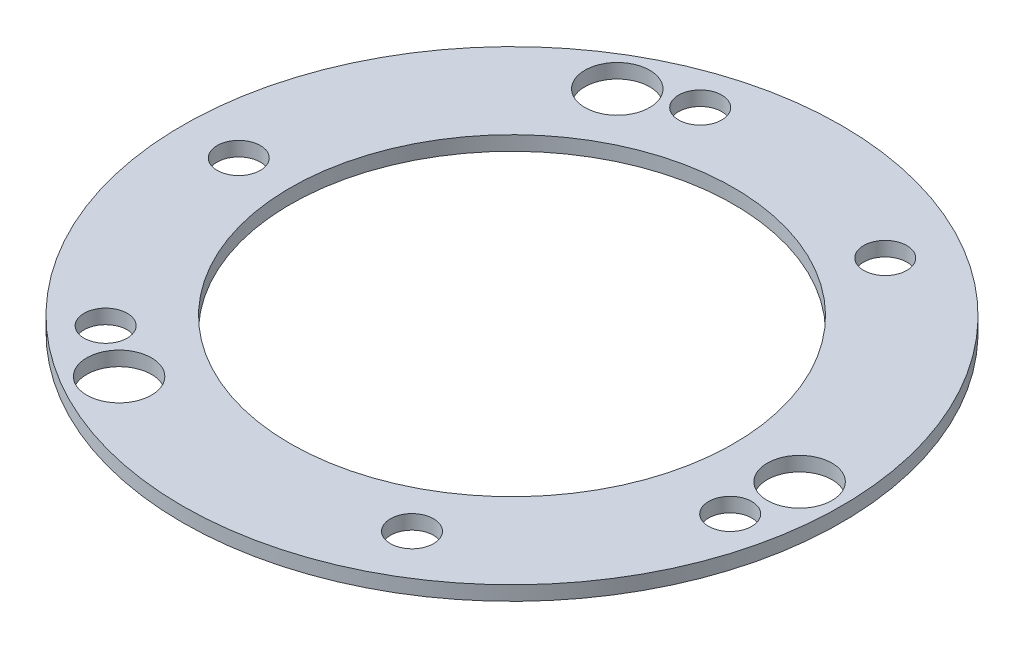
ISO-10303-21;
HEADER;
FILE_DESCRIPTION(('STEP AP214'),'2;1');
FILE_NAME('part.step','',(''),(''),'','','');
FILE_SCHEMA(('AUTOMOTIVE_DESIGN { 1 0 10303 214 1 1 1 1 }'));
ENDSEC;
DATA;
#1=APPLICATION_CONTEXT('core data for automotive mechanical design processes');
#2=APPLICATION_PROTOCOL_DEFINITION('international standard','automotive_design',2000,#1);
#3=PRODUCT_CONTEXT('',#1,'mechanical');
#4=PRODUCT('Part','Part','',(#3));
#5=PRODUCT_RELATED_PRODUCT_CATEGORY('part','',(#4));
#6=PRODUCT_DEFINITION_FORMATION('','',#4);
#7=PRODUCT_DEFINITION_CONTEXT('part definition',#1,'design');
#8=PRODUCT_DEFINITION('design','',#6,#7);
#9=PRODUCT_DEFINITION_SHAPE('','',#8);
#10=(LENGTH_UNIT() NAMED_UNIT(*) SI_UNIT(.MILLI.,.METRE.));
#11=(NAMED_UNIT(*) PLANE_ANGLE_UNIT() SI_UNIT($,.RADIAN.));
#12=(NAMED_UNIT(*) SI_UNIT($,.STERADIAN.) SOLID_ANGLE_UNIT());
#13=UNCERTAINTY_MEASURE_WITH_UNIT(LENGTH_MEASURE(1.E-05),#10,'distance_accuracy_value','');
#14=(GEOMETRIC_REPRESENTATION_CONTEXT(3) GLOBAL_UNCERTAINTY_ASSIGNED_CONTEXT((#13)) GLOBAL_UNIT_ASSIGNED_CONTEXT((#10,
#11,#12)) REPRESENTATION_CONTEXT('',''));
#15=CARTESIAN_POINT('',(0.,0.,0.));
#16=DIRECTION('',(0.,0.,1.));
#17=DIRECTION('',(1.,0.,0.));
#18=AXIS2_PLACEMENT_3D('',#15,#16,#17);
#19=CARTESIAN_POINT('',(0.,12.,0.));
#20=DIRECTION('',(0.,1.,0.));
#21=DIRECTION('',(0.,0.,1.));
#22=AXIS2_PLACEMENT_3D('',#19,#20,#21);
#23=PLANE('',#22);
#24=CARTESIAN_POINT('',(-228.,12.,0.));
#25=DIRECTION('',(0.,1.,0.));
#26=DIRECTION('',(0.,0.,1.));
#27=AXIS2_PLACEMENT_3D('',#24,#25,#26);
#28=CIRCLE('',#27,18.);
#29=CARTESIAN_POINT('',(-228.,12.,18.));
#30=VERTEX_POINT('',#29);
#31=EDGE_CURVE('E57',#30,#30,#28,.T.);
#32=ORIENTED_EDGE('',*,*,#31,.F.);
#33=EDGE_LOOP('',(#32));
#34=FACE_BOUND('',#33,.T.);
#35=CARTESIAN_POINT('',(114.,12.,-197.453792062852));
#36=DIRECTION('',(0.,1.,0.));
#37=DIRECTION('',(0.,0.,1.));
#38=AXIS2_PLACEMENT_3D('',#35,#36,#37);
#39=CIRCLE('',#38,18.);
#40=CARTESIAN_POINT('',(114.,12.,-179.453792062852));
#41=VERTEX_POINT('',#40);
#42=EDGE_CURVE('E136',#41,#41,#39,.T.);
#43=ORIENTED_EDGE('',*,*,#42,.F.);
#44=EDGE_LOOP('',(#43));
#45=FACE_BOUND('',#44,.T.);
#46=CARTESIAN_POINT('',(114.000000000001,12.,197.453792062852));
#47=DIRECTION('',(0.,1.,0.));
#48=DIRECTION('',(0.,0.,1.));
#49=AXIS2_PLACEMENT_3D('',#46,#47,#48);
#50=CIRCLE('',#49,18.);
#51=CARTESIAN_POINT('',(114.000000000001,12.,215.453792062852));
#52=VERTEX_POINT('',#51);
#53=EDGE_CURVE('E140',#52,#52,#50,.T.);
#54=ORIENTED_EDGE('',*,*,#53,.F.);
#55=EDGE_LOOP('',(#54));
#56=FACE_BOUND('',#55,.T.);
#57=CARTESIAN_POINT('',(-71.9353451816777,12.,-228.965731308405));
#58=DIRECTION('',(0.,1.,0.));
#59=DIRECTION('',(0.,0.,1.));
#60=AXIS2_PLACEMENT_3D('',#57,#58,#59);
#61=CIRCLE('',#60,18.);
#62=CARTESIAN_POINT('',(-71.9353451816777,12.,-210.965731308405));
#63=VERTEX_POINT('',#62);
#64=EDGE_CURVE('E75',#63,#63,#61,.T.);
#65=ORIENTED_EDGE('',*,*,#64,.F.);
#66=EDGE_LOOP('',(#65));
#67=FACE_BOUND('',#66,.T.);
#68=CARTESIAN_POINT('',(-120.,12.,207.846096908265));
#69=DIRECTION('',(0.,1.,0.));
#70=DIRECTION('',(0.,0.,1.));
#71=AXIS2_PLACEMENT_3D('',#68,#69,#70);
#72=CIRCLE('',#71,27.);
#73=CARTESIAN_POINT('',(-120.,12.,234.846096908265));
#74=VERTEX_POINT('',#73);
#75=EDGE_CURVE('E87',#74,#74,#72,.T.);
#76=ORIENTED_EDGE('',*,*,#75,.F.);
#77=EDGE_LOOP('',(#76));
#78=FACE_BOUND('',#77,.T.);
#79=CARTESIAN_POINT('',(240.,12.,0.));
#80=DIRECTION('',(0.,1.,0.));
#81=DIRECTION('',(0.,0.,1.));
#82=AXIS2_PLACEMENT_3D('',#79,#80,#81);
#83=CIRCLE('',#82,27.);
#84=CARTESIAN_POINT('',(240.,12.,27.));
#85=VERTEX_POINT('',#84);
#86=EDGE_CURVE('E99',#85,#85,#83,.T.);
#87=ORIENTED_EDGE('',*,*,#86,.F.);
#88=EDGE_LOOP('',(#87));
#89=FACE_BOUND('',#88,.T.);
#90=CARTESIAN_POINT('',(0.,12.,0.));
#91=DIRECTION('',(0.,1.,0.));
#92=DIRECTION('',(0.,0.,1.));
#93=AXIS2_PLACEMENT_3D('',#90,#91,#92);
#94=CIRCLE('',#93,275.);
#95=CARTESIAN_POINT('',(0.,12.,275.));
#96=VERTEX_POINT('',#95);
#97=EDGE_CURVE('E10',#96,#96,#94,.T.);
#98=ORIENTED_EDGE('',*,*,#97,.T.);
#99=EDGE_LOOP('',(#98));
#100=FACE_BOUND('',#99,.T.);
#101=CARTESIAN_POINT('',(0.,12.,0.));
#102=DIRECTION('',(0.,1.,0.));
#103=DIRECTION('',(0.,0.,1.));
#104=AXIS2_PLACEMENT_3D('',#101,#102,#103);
#105=CIRCLE('',#104,185.);
#106=CARTESIAN_POINT('',(0.,12.,185.));
#107=VERTEX_POINT('',#106);
#108=EDGE_CURVE('E48',#107,#107,#105,.T.);
#109=ORIENTED_EDGE('',*,*,#108,.F.);
#110=EDGE_LOOP('',(#109));
#111=FACE_BOUND('',#110,.T.);
#112=CARTESIAN_POINT('',(234.2578125,12.,52.1850292968668));
#113=DIRECTION('',(0.,1.,0.));
#114=DIRECTION('',(0.,0.,1.));
#115=AXIS2_PLACEMENT_3D('',#112,#113,#114);
#116=CIRCLE('',#115,18.);
#117=CARTESIAN_POINT('',(234.2578125,12.,70.1850292968668));
#118=VERTEX_POINT('',#117);
#119=EDGE_CURVE('E93',#118,#118,#116,.T.);
#120=ORIENTED_EDGE('',*,*,#119,.F.);
#121=EDGE_LOOP('',(#120));
#122=FACE_BOUND('',#121,.T.);
#123=CARTESIAN_POINT('',(-120.,12.,-207.846096908266));
#124=DIRECTION('',(0.,1.,0.));
#125=DIRECTION('',(0.,0.,1.));
#126=AXIS2_PLACEMENT_3D('',#123,#124,#125);
#127=CIRCLE('',#126,27.);
#128=CARTESIAN_POINT('',(-120.,12.,-180.846096908265));
#129=VERTEX_POINT('',#128);
#130=EDGE_CURVE('E81',#129,#129,#127,.T.);
#131=ORIENTED_EDGE('',*,*,#130,.F.);
#132=EDGE_LOOP('',(#131));
#133=FACE_BOUND('',#132,.T.);
#134=CARTESIAN_POINT('',(-162.322467318322,12.,176.780702011538));
#135=DIRECTION('',(0.,1.,0.));
#136=DIRECTION('',(0.,0.,1.));
#137=AXIS2_PLACEMENT_3D('',#134,#135,#136);
#138=CIRCLE('',#137,18.);
#139=CARTESIAN_POINT('',(-162.322467318322,12.,194.780702011538));
#140=VERTEX_POINT('',#139);
#141=EDGE_CURVE('E66',#140,#140,#138,.T.);
#142=ORIENTED_EDGE('',*,*,#141,.F.);
#143=EDGE_LOOP('',(#142));
#144=FACE_BOUND('',#143,.T.);
#145=ADVANCED_FACE('F35',(#34,#45,#56,#67,#78,#89,#100,#111,#122,#133,#144),#23,.T.);
#146=CARTESIAN_POINT('',(0.,0.,0.));
#147=DIRECTION('',(0.,1.,0.));
#148=DIRECTION('',(0.,0.,1.));
#149=AXIS2_PLACEMENT_3D('',#146,#147,#148);
#150=PLANE('',#149);
#151=CARTESIAN_POINT('',(-228.,0.,0.));
#152=DIRECTION('',(0.,1.,0.));
#153=DIRECTION('',(0.,0.,1.));
#154=AXIS2_PLACEMENT_3D('',#151,#152,#153);
#155=CIRCLE('',#154,18.);
#156=CARTESIAN_POINT('',(-228.,0.,18.));
#157=VERTEX_POINT('',#156);
#158=EDGE_CURVE('E39',#157,#157,#155,.T.);
#159=ORIENTED_EDGE('',*,*,#158,.T.);
#160=EDGE_LOOP('',(#159));
#161=FACE_BOUND('',#160,.T.);
#162=CARTESIAN_POINT('',(114.,0.,-197.453792062852));
#163=DIRECTION('',(0.,1.,0.));
#164=DIRECTION('',(0.,0.,1.));
#165=AXIS2_PLACEMENT_3D('',#162,#163,#164);
#166=CIRCLE('',#165,18.);
#167=CARTESIAN_POINT('',(114.,0.,-179.453792062852));
#168=VERTEX_POINT('',#167);
#169=EDGE_CURVE('E56',#168,#168,#166,.T.);
#170=ORIENTED_EDGE('',*,*,#169,.T.);
#171=EDGE_LOOP('',(#170));
#172=FACE_BOUND('',#171,.T.);
#173=CARTESIAN_POINT('',(114.000000000001,0.,197.453792062852));
#174=DIRECTION('',(0.,1.,0.));
#175=DIRECTION('',(0.,0.,1.));
#176=AXIS2_PLACEMENT_3D('',#173,#174,#175);
#177=CIRCLE('',#176,18.);
#178=CARTESIAN_POINT('',(114.000000000001,0.,215.453792062852));
#179=VERTEX_POINT('',#178);
#180=EDGE_CURVE('E54',#179,#179,#177,.T.);
#181=ORIENTED_EDGE('',*,*,#180,.T.);
#182=EDGE_LOOP('',(#181));
#183=FACE_BOUND('',#182,.T.);
#184=CARTESIAN_POINT('',(0.,0.,0.));
#185=DIRECTION('',(0.,1.,0.));
#186=DIRECTION('',(0.,0.,1.));
#187=AXIS2_PLACEMENT_3D('',#184,#185,#186);
#188=CIRCLE('',#187,275.);
#189=CARTESIAN_POINT('',(0.,0.,275.));
#190=VERTEX_POINT('',#189);
#191=EDGE_CURVE('E43',#190,#190,#188,.T.);
#192=ORIENTED_EDGE('',*,*,#191,.F.);
#193=EDGE_LOOP('',(#192));
#194=FACE_BOUND('',#193,.T.);
#195=CARTESIAN_POINT('',(0.,0.,0.));
#196=DIRECTION('',(0.,1.,0.));
#197=DIRECTION('',(0.,0.,1.));
#198=AXIS2_PLACEMENT_3D('',#195,#196,#197);
#199=CIRCLE('',#198,185.);
#200=CARTESIAN_POINT('',(0.,0.,185.));
#201=VERTEX_POINT('',#200);
#202=EDGE_CURVE('E51',#201,#201,#199,.T.);
#203=ORIENTED_EDGE('',*,*,#202,.T.);
#204=EDGE_LOOP('',(#203));
#205=FACE_BOUND('',#204,.T.);
#206=CARTESIAN_POINT('',(240.,0.,0.));
#207=DIRECTION('',(0.,1.,0.));
#208=DIRECTION('',(0.,0.,1.));
#209=AXIS2_PLACEMENT_3D('',#206,#207,#208);
#210=CIRCLE('',#209,27.);
#211=CARTESIAN_POINT('',(240.,0.,27.));
#212=VERTEX_POINT('',#211);
#213=EDGE_CURVE('E96',#212,#212,#210,.T.);
#214=ORIENTED_EDGE('',*,*,#213,.T.);
#215=EDGE_LOOP('',(#214));
#216=FACE_BOUND('',#215,.T.);
#217=CARTESIAN_POINT('',(234.2578125,0.,52.1850292968668));
#218=DIRECTION('',(0.,1.,0.));
#219=DIRECTION('',(0.,0.,1.));
#220=AXIS2_PLACEMENT_3D('',#217,#218,#219);
#221=CIRCLE('',#220,18.);
#222=CARTESIAN_POINT('',(234.2578125,0.,70.1850292968668));
#223=VERTEX_POINT('',#222);
#224=EDGE_CURVE('E90',#223,#223,#221,.T.);
#225=ORIENTED_EDGE('',*,*,#224,.T.);
#226=EDGE_LOOP('',(#225));
#227=FACE_BOUND('',#226,.T.);
#228=CARTESIAN_POINT('',(-120.,0.,207.846096908265));
#229=DIRECTION('',(0.,1.,0.));
#230=DIRECTION('',(0.,0.,1.));
#231=AXIS2_PLACEMENT_3D('',#228,#229,#230);
#232=CIRCLE('',#231,27.);
#233=CARTESIAN_POINT('',(-120.,0.,234.846096908265));
#234=VERTEX_POINT('',#233);
#235=EDGE_CURVE('E84',#234,#234,#232,.T.);
#236=ORIENTED_EDGE('',*,*,#235,.T.);
#237=EDGE_LOOP('',(#236));
#238=FACE_BOUND('',#237,.T.);
#239=CARTESIAN_POINT('',(-120.,0.,-207.846096908266));
#240=DIRECTION('',(0.,1.,0.));
#241=DIRECTION('',(0.,0.,1.));
#242=AXIS2_PLACEMENT_3D('',#239,#240,#241);
#243=CIRCLE('',#242,27.);
#244=CARTESIAN_POINT('',(-120.,0.,-180.846096908265));
#245=VERTEX_POINT('',#244);
#246=EDGE_CURVE('E78',#245,#245,#243,.T.);
#247=ORIENTED_EDGE('',*,*,#246,.T.);
#248=EDGE_LOOP('',(#247));
#249=FACE_BOUND('',#248,.T.);
#250=CARTESIAN_POINT('',(-71.9353451816777,0.,-228.965731308405));
#251=DIRECTION('',(0.,1.,0.));
#252=DIRECTION('',(0.,0.,1.));
#253=AXIS2_PLACEMENT_3D('',#250,#251,#252);
#254=CIRCLE('',#253,18.);
#255=CARTESIAN_POINT('',(-71.9353451816777,0.,-210.965731308405));
#256=VERTEX_POINT('',#255);
#257=EDGE_CURVE('E71',#256,#256,#254,.T.);
#258=ORIENTED_EDGE('',*,*,#257,.T.);
#259=EDGE_LOOP('',(#258));
#260=FACE_BOUND('',#259,.T.);
#261=CARTESIAN_POINT('',(-162.322467318322,0.,176.780702011538));
#262=DIRECTION('',(0.,1.,0.));
#263=DIRECTION('',(0.,0.,1.));
#264=AXIS2_PLACEMENT_3D('',#261,#262,#263);
#265=CIRCLE('',#264,18.);
#266=CARTESIAN_POINT('',(-162.322467318322,0.,194.780702011538));
#267=VERTEX_POINT('',#266);
#268=EDGE_CURVE('E62',#267,#267,#265,.T.);
#269=ORIENTED_EDGE('',*,*,#268,.T.);
#270=EDGE_LOOP('',(#269));
#271=FACE_BOUND('',#270,.T.);
#272=ADVANCED_FACE('F109',(#161,#172,#183,#194,#205,#216,#227,#238,#249,#260,#271),#150,.F.);
#273=CARTESIAN_POINT('',(0.,12.,0.));
#274=DIRECTION('',(0.,-1.,0.));
#275=DIRECTION('',(0.,0.,-1.));
#276=AXIS2_PLACEMENT_3D('',#273,#274,#275);
#277=CYLINDRICAL_SURFACE('',#276,275.);
#278=ORIENTED_EDGE('',*,*,#97,.F.);
#279=EDGE_LOOP('',(#278));
#280=FACE_BOUND('',#279,.T.);
#281=ORIENTED_EDGE('',*,*,#191,.T.);
#282=EDGE_LOOP('',(#281));
#283=FACE_BOUND('',#282,.T.);
#284=ADVANCED_FACE('F37',(#280,#283),#277,.T.);
#285=CARTESIAN_POINT('',(0.,12.,0.));
#286=DIRECTION('',(0.,-1.,0.));
#287=DIRECTION('',(0.,0.,-1.));
#288=AXIS2_PLACEMENT_3D('',#285,#286,#287);
#289=CYLINDRICAL_SURFACE('',#288,185.);
#290=ORIENTED_EDGE('',*,*,#108,.T.);
#291=EDGE_LOOP('',(#290));
#292=FACE_BOUND('',#291,.T.);
#293=ORIENTED_EDGE('',*,*,#202,.F.);
#294=EDGE_LOOP('',(#293));
#295=FACE_BOUND('',#294,.T.);
#296=ADVANCED_FACE('F112',(#292,#295),#289,.F.);
#297=CARTESIAN_POINT('',(240.,12.,0.));
#298=DIRECTION('',(0.,-1.,0.));
#299=DIRECTION('',(0.,0.,-1.));
#300=AXIS2_PLACEMENT_3D('',#297,#298,#299);
#301=CYLINDRICAL_SURFACE('',#300,27.);
#302=ORIENTED_EDGE('',*,*,#86,.T.);
#303=EDGE_LOOP('',(#302));
#304=FACE_BOUND('',#303,.T.);
#305=ORIENTED_EDGE('',*,*,#213,.F.);
#306=EDGE_LOOP('',(#305));
#307=FACE_BOUND('',#306,.T.);
#308=ADVANCED_FACE('F114',(#304,#307),#301,.F.);
#309=CARTESIAN_POINT('',(234.2578125,12.,52.1850292968668));
#310=DIRECTION('',(0.,-1.,0.));
#311=DIRECTION('',(0.,0.,-1.));
#312=AXIS2_PLACEMENT_3D('',#309,#310,#311);
#313=CYLINDRICAL_SURFACE('',#312,18.);
#314=ORIENTED_EDGE('',*,*,#119,.T.);
#315=EDGE_LOOP('',(#314));
#316=FACE_BOUND('',#315,.T.);
#317=ORIENTED_EDGE('',*,*,#224,.F.);
#318=EDGE_LOOP('',(#317));
#319=FACE_BOUND('',#318,.T.);
#320=ADVANCED_FACE('F120',(#316,#319),#313,.F.);
#321=CARTESIAN_POINT('',(-120.,12.,207.846096908265));
#322=DIRECTION('',(0.,-1.,0.));
#323=DIRECTION('',(0.,0.,-1.));
#324=AXIS2_PLACEMENT_3D('',#321,#322,#323);
#325=CYLINDRICAL_SURFACE('',#324,27.);
#326=ORIENTED_EDGE('',*,*,#75,.T.);
#327=EDGE_LOOP('',(#326));
#328=FACE_BOUND('',#327,.T.);
#329=ORIENTED_EDGE('',*,*,#235,.F.);
#330=EDGE_LOOP('',(#329));
#331=FACE_BOUND('',#330,.T.);
#332=ADVANCED_FACE('F174',(#328,#331),#325,.F.);
#333=CARTESIAN_POINT('',(-120.,12.,-207.846096908266));
#334=DIRECTION('',(0.,-1.,0.));
#335=DIRECTION('',(0.,0.,-1.));
#336=AXIS2_PLACEMENT_3D('',#333,#334,#335);
#337=CYLINDRICAL_SURFACE('',#336,27.);
#338=ORIENTED_EDGE('',*,*,#130,.T.);
#339=EDGE_LOOP('',(#338));
#340=FACE_BOUND('',#339,.T.);
#341=ORIENTED_EDGE('',*,*,#246,.F.);
#342=EDGE_LOOP('',(#341));
#343=FACE_BOUND('',#342,.T.);
#344=ADVANCED_FACE('F167',(#340,#343),#337,.F.);
#345=CARTESIAN_POINT('',(-71.9353451816777,12.,-228.965731308405));
#346=DIRECTION('',(0.,-1.,0.));
#347=DIRECTION('',(0.,0.,-1.));
#348=AXIS2_PLACEMENT_3D('',#345,#346,#347);
#349=CYLINDRICAL_SURFACE('',#348,18.);
#350=ORIENTED_EDGE('',*,*,#64,.T.);
#351=EDGE_LOOP('',(#350));
#352=FACE_BOUND('',#351,.T.);
#353=ORIENTED_EDGE('',*,*,#257,.F.);
#354=EDGE_LOOP('',(#353));
#355=FACE_BOUND('',#354,.T.);
#356=ADVANCED_FACE('F158',(#352,#355),#349,.F.);
#357=CARTESIAN_POINT('',(-162.322467318322,12.,176.780702011538));
#358=DIRECTION('',(0.,-1.,0.));
#359=DIRECTION('',(0.,0.,-1.));
#360=AXIS2_PLACEMENT_3D('',#357,#358,#359);
#361=CYLINDRICAL_SURFACE('',#360,18.);
#362=ORIENTED_EDGE('',*,*,#141,.T.);
#363=EDGE_LOOP('',(#362));
#364=FACE_BOUND('',#363,.T.);
#365=ORIENTED_EDGE('',*,*,#268,.F.);
#366=EDGE_LOOP('',(#365));
#367=FACE_BOUND('',#366,.T.);
#368=ADVANCED_FACE('F154',(#364,#367),#361,.F.);
#369=CARTESIAN_POINT('',(114.000000000001,-1.2E-05,197.453792062852));
#370=DIRECTION('',(0.,1.,0.));
#371=DIRECTION('',(0.,0.,1.));
#372=AXIS2_PLACEMENT_3D('',#369,#370,#371);
#373=CYLINDRICAL_SURFACE('',#372,18.);
#374=CARTESIAN_POINT('',(114.000000000001,12.,215.453792062852));
#375=CARTESIAN_POINT('',(114.000000000001,11.875,215.453792062852));
#376=CARTESIAN_POINT('',(114.000000000001,11.75,215.453792062852));
#377=CARTESIAN_POINT('',(114.000000000001,11.5,215.453792062852));
#378=CARTESIAN_POINT('',(114.000000000001,11.375,215.453792062852));
#379=CARTESIAN_POINT('',(114.000000000001,11.125,215.453792062852));
#380=CARTESIAN_POINT('',(114.000000000001,11.,215.453792062852));
#381=CARTESIAN_POINT('',(114.000000000001,10.75,215.453792062852));
#382=CARTESIAN_POINT('',(114.000000000001,10.625,215.453792062852));
#383=CARTESIAN_POINT('',(114.000000000001,10.375,215.453792062852));
#384=CARTESIAN_POINT('',(114.000000000001,10.25,215.453792062852));
#385=CARTESIAN_POINT('',(114.000000000001,10.,215.453792062852));
#386=CARTESIAN_POINT('',(114.000000000001,9.875,215.453792062852));
#387=CARTESIAN_POINT('',(114.000000000001,9.625,215.453792062852));
#388=CARTESIAN_POINT('',(114.000000000001,9.5,215.453792062852));
#389=CARTESIAN_POINT('',(114.000000000001,9.25,215.453792062852));
#390=CARTESIAN_POINT('',(114.000000000001,9.125,215.453792062852));
#391=CARTESIAN_POINT('',(114.000000000001,8.875,215.453792062852));
#392=CARTESIAN_POINT('',(114.000000000001,8.75,215.453792062852));
#393=CARTESIAN_POINT('',(114.000000000001,8.5,215.453792062852));
#394=CARTESIAN_POINT('',(114.000000000001,8.375,215.453792062852));
#395=CARTESIAN_POINT('',(114.000000000001,8.125,215.453792062852));
#396=CARTESIAN_POINT('',(114.000000000001,8.,215.453792062852));
#397=CARTESIAN_POINT('',(114.000000000001,7.75,215.453792062852));
#398=CARTESIAN_POINT('',(114.000000000001,7.625,215.453792062852));
#399=CARTESIAN_POINT('',(114.000000000001,7.375,215.453792062852));
#400=CARTESIAN_POINT('',(114.000000000001,7.25,215.453792062852));
#401=CARTESIAN_POINT('',(114.000000000001,7.,215.453792062852));
#402=CARTESIAN_POINT('',(114.000000000001,6.875,215.453792062852));
#403=CARTESIAN_POINT('',(114.000000000001,6.625,215.453792062852));
#404=CARTESIAN_POINT('',(114.000000000001,6.5,215.453792062852));
#405=CARTESIAN_POINT('',(114.000000000001,6.25,215.453792062852));
#406=CARTESIAN_POINT('',(114.000000000001,6.125,215.453792062852));
#407=CARTESIAN_POINT('',(114.000000000001,5.875,215.453792062852));
#408=CARTESIAN_POINT('',(114.000000000001,5.75,215.453792062852));
#409=CARTESIAN_POINT('',(114.000000000001,5.5,215.453792062852));
#410=CARTESIAN_POINT('',(114.000000000001,5.375,215.453792062852));
#411=CARTESIAN_POINT('',(114.000000000001,5.125,215.453792062852));
#412=CARTESIAN_POINT('',(114.000000000001,5.,215.453792062852));
#413=CARTESIAN_POINT('',(114.000000000001,4.75,215.453792062852));
#414=CARTESIAN_POINT('',(114.000000000001,4.625,215.453792062852));
#415=CARTESIAN_POINT('',(114.000000000001,4.375,215.453792062852));
#416=CARTESIAN_POINT('',(114.000000000001,4.25,215.453792062852));
#417=CARTESIAN_POINT('',(114.000000000001,4.,215.453792062852));
#418=CARTESIAN_POINT('',(114.000000000001,3.875,215.453792062852));
#419=CARTESIAN_POINT('',(114.000000000001,3.625,215.453792062852));
#420=CARTESIAN_POINT('',(114.000000000001,3.5,215.453792062852));
#421=CARTESIAN_POINT('',(114.000000000001,3.25,215.453792062852));
#422=CARTESIAN_POINT('',(114.000000000001,3.125,215.453792062852));
#423=CARTESIAN_POINT('',(114.000000000001,2.875,215.453792062852));
#424=CARTESIAN_POINT('',(114.000000000001,2.75,215.453792062852));
#425=CARTESIAN_POINT('',(114.000000000001,2.5,215.453792062852));
#426=CARTESIAN_POINT('',(114.000000000001,2.375,215.453792062852));
#427=CARTESIAN_POINT('',(114.000000000001,2.125,215.453792062852));
#428=CARTESIAN_POINT('',(114.000000000001,2.,215.453792062852));
#429=CARTESIAN_POINT('',(114.000000000001,1.75,215.453792062852));
#430=CARTESIAN_POINT('',(114.000000000001,1.625,215.453792062852));
#431=CARTESIAN_POINT('',(114.000000000001,1.375,215.453792062852));
#432=CARTESIAN_POINT('',(114.000000000001,1.25,215.453792062852));
#433=CARTESIAN_POINT('',(114.000000000001,1.,215.453792062852));
#434=CARTESIAN_POINT('',(114.000000000001,0.875000000000001,215.453792062852));
#435=CARTESIAN_POINT('',(114.000000000001,0.625000000000001,215.453792062852));
#436=CARTESIAN_POINT('',(114.000000000001,0.500000000000001,215.453792062852));
#437=CARTESIAN_POINT('',(114.000000000001,0.250000000000001,215.453792062852));
#438=CARTESIAN_POINT('',(114.000000000001,0.125000000000001,215.453792062852));
#439=CARTESIAN_POINT('',(114.000000000001,0.,215.453792062852));
#440=B_SPLINE_CURVE_WITH_KNOTS('',3,(#374,#375,#376,#377,#378,#379,#380,#381,#382,#383,#384,
#385,#386,#387,#388,#389,#390,#391,#392,#393,#394,#395,#396,#397,#398,#399,#400,#401,#402,#403,
#404,#405,#406,#407,#408,#409,#410,#411,#412,#413,#414,#415,#416,#417,#418,#419,#420,#421,#422,
#423,#424,#425,#426,#427,#428,#429,#430,#431,#432,#433,#434,#435,#436,#437,#438,#439),
.UNSPECIFIED.,.F.,.F.,(4,2,2,2,2,2,2,2,2,2,2,2,2,2,2,2,2,2,2,2,2,2,2,2,2,2,2,2,2,2,2,2,4),(0.,
0.375,0.750000000000001,1.125,1.5,1.875,2.25,2.625,3.,3.375,3.75,4.125,4.5,4.875,5.25,5.625,6.,
6.375,6.75,7.125,7.5,7.875,8.25,8.625,9.,9.375,9.75,10.125,10.5,10.875,11.25,11.625,12.),.UNSPECIFIED.);
#441=EDGE_CURVE('BSEAM157',#52,#179,#440,.T.);
#442=ORIENTED_EDGE('',*,*,#53,.T.);
#443=ORIENTED_EDGE('',*,*,#180,.F.);
#444=ORIENTED_EDGE('',*,*,#441,.T.);
#445=ORIENTED_EDGE('',*,*,#441,.F.);
#446=EDGE_LOOP('',(#442,#444,#443,#445));
#447=FACE_BOUND('',#446,.T.);
#448=ADVANCED_FACE('F157',(#447),#373,.F.);
#449=CARTESIAN_POINT('',(114.,-1.2E-05,-197.453792062852));
#450=DIRECTION('',(0.,1.,0.));
#451=DIRECTION('',(0.,0.,1.));
#452=AXIS2_PLACEMENT_3D('',#449,#450,#451);
#453=CYLINDRICAL_SURFACE('',#452,18.);
#454=CARTESIAN_POINT('',(114.,12.,-179.453792062852));
#455=CARTESIAN_POINT('',(114.,11.875,-179.453792062852));
#456=CARTESIAN_POINT('',(114.,11.75,-179.453792062852));
#457=CARTESIAN_POINT('',(114.,11.5,-179.453792062852));
#458=CARTESIAN_POINT('',(114.,11.375,-179.453792062852));
#459=CARTESIAN_POINT('',(114.,11.125,-179.453792062852));
#460=CARTESIAN_POINT('',(114.,11.,-179.453792062852));
#461=CARTESIAN_POINT('',(114.,10.75,-179.453792062852));
#462=CARTESIAN_POINT('',(114.,10.625,-179.453792062852));
#463=CARTESIAN_POINT('',(114.,10.375,-179.453792062852));
#464=CARTESIAN_POINT('',(114.,10.25,-179.453792062852));
#465=CARTESIAN_POINT('',(114.,10.,-179.453792062852));
#466=CARTESIAN_POINT('',(114.,9.875,-179.453792062852));
#467=CARTESIAN_POINT('',(114.,9.625,-179.453792062852));
#468=CARTESIAN_POINT('',(114.,9.5,-179.453792062852));
#469=CARTESIAN_POINT('',(114.,9.25,-179.453792062852));
#470=CARTESIAN_POINT('',(114.,9.125,-179.453792062852));
#471=CARTESIAN_POINT('',(114.,8.875,-179.453792062852));
#472=CARTESIAN_POINT('',(114.,8.75,-179.453792062852));
#473=CARTESIAN_POINT('',(114.,8.5,-179.453792062852));
#474=CARTESIAN_POINT('',(114.,8.375,-179.453792062852));
#475=CARTESIAN_POINT('',(114.,8.125,-179.453792062852));
#476=CARTESIAN_POINT('',(114.,8.,-179.453792062852));
#477=CARTESIAN_POINT('',(114.,7.75,-179.453792062852));
#478=CARTESIAN_POINT('',(114.,7.625,-179.453792062852));
#479=CARTESIAN_POINT('',(114.,7.375,-179.453792062852));
#480=CARTESIAN_POINT('',(114.,7.25,-179.453792062852));
#481=CARTESIAN_POINT('',(114.,7.,-179.453792062852));
#482=CARTESIAN_POINT('',(114.,6.875,-179.453792062852));
#483=CARTESIAN_POINT('',(114.,6.625,-179.453792062852));
#484=CARTESIAN_POINT('',(114.,6.5,-179.453792062852));
#485=CARTESIAN_POINT('',(114.,6.25,-179.453792062852));
#486=CARTESIAN_POINT('',(114.,6.125,-179.453792062852));
#487=CARTESIAN_POINT('',(114.,5.875,-179.453792062852));
#488=CARTESIAN_POINT('',(114.,5.75,-179.453792062852));
#489=CARTESIAN_POINT('',(114.,5.5,-179.453792062852));
#490=CARTESIAN_POINT('',(114.,5.375,-179.453792062852));
#491=CARTESIAN_POINT('',(114.,5.125,-179.453792062852));
#492=CARTESIAN_POINT('',(114.,5.,-179.453792062852));
#493=CARTESIAN_POINT('',(114.,4.75,-179.453792062852));
#494=CARTESIAN_POINT('',(114.,4.625,-179.453792062852));
#495=CARTESIAN_POINT('',(114.,4.375,-179.453792062852));
#496=CARTESIAN_POINT('',(114.,4.25,-179.453792062852));
#497=CARTESIAN_POINT('',(114.,4.,-179.453792062852));
#498=CARTESIAN_POINT('',(114.,3.875,-179.453792062852));
#499=CARTESIAN_POINT('',(114.,3.625,-179.453792062852));
#500=CARTESIAN_POINT('',(114.,3.5,-179.453792062852));
#501=CARTESIAN_POINT('',(114.,3.25,-179.453792062852));
#502=CARTESIAN_POINT('',(114.,3.125,-179.453792062852));
#503=CARTESIAN_POINT('',(114.,2.875,-179.453792062852));
#504=CARTESIAN_POINT('',(114.,2.75,-179.453792062852));
#505=CARTESIAN_POINT('',(114.,2.5,-179.453792062852));
#506=CARTESIAN_POINT('',(114.,2.375,-179.453792062852));
#507=CARTESIAN_POINT('',(114.,2.125,-179.453792062852));
#508=CARTESIAN_POINT('',(114.,2.,-179.453792062852));
#509=CARTESIAN_POINT('',(114.,1.75,-179.453792062852));
#510=CARTESIAN_POINT('',(114.,1.625,-179.453792062852));
#511=CARTESIAN_POINT('',(114.,1.375,-179.453792062852));
#512=CARTESIAN_POINT('',(114.,1.25,-179.453792062852));
#513=CARTESIAN_POINT('',(114.,1.,-179.453792062852));
#514=CARTESIAN_POINT('',(114.,0.875000000000001,-179.453792062852));
#515=CARTESIAN_POINT('',(114.,0.625000000000001,-179.453792062852));
#516=CARTESIAN_POINT('',(114.,0.500000000000001,-179.453792062852));
#517=CARTESIAN_POINT('',(114.,0.250000000000001,-179.453792062852));
#518=CARTESIAN_POINT('',(114.,0.125000000000001,-179.453792062852));
#519=CARTESIAN_POINT('',(114.,0.,-179.453792062852));
#520=B_SPLINE_CURVE_WITH_KNOTS('',3,(#454,#455,#456,#457,#458,#459,#460,#461,#462,#463,#464,
#465,#466,#467,#468,#469,#470,#471,#472,#473,#474,#475,#476,#477,#478,#479,#480,#481,#482,#483,
#484,#485,#486,#487,#488,#489,#490,#491,#492,#493,#494,#495,#496,#497,#498,#499,#500,#501,#502,
#503,#504,#505,#506,#507,#508,#509,#510,#511,#512,#513,#514,#515,#516,#517,#518,#519),
.UNSPECIFIED.,.F.,.F.,(4,2,2,2,2,2,2,2,2,2,2,2,2,2,2,2,2,2,2,2,2,2,2,2,2,2,2,2,2,2,2,2,4),(0.,
0.375,0.750000000000001,1.125,1.5,1.875,2.25,2.625,3.,3.375,3.75,4.125,4.5,4.875,5.25,5.625,6.,
6.375,6.75,7.125,7.5,7.875,8.25,8.625,9.,9.375,9.75,10.125,10.5,10.875,11.25,11.625,12.),.UNSPECIFIED.);
#521=EDGE_CURVE('BSEAM164',#41,#168,#520,.T.);
#522=ORIENTED_EDGE('',*,*,#42,.T.);
#523=ORIENTED_EDGE('',*,*,#169,.F.);
#524=ORIENTED_EDGE('',*,*,#521,.T.);
#525=ORIENTED_EDGE('',*,*,#521,.F.);
#526=EDGE_LOOP('',(#522,#524,#523,#525));
#527=FACE_BOUND('',#526,.T.);
#528=ADVANCED_FACE('F164',(#527),#453,.F.);
#529=CARTESIAN_POINT('',(-228.,-1.2E-05,0.));
#530=DIRECTION('',(0.,1.,0.));
#531=DIRECTION('',(0.,0.,1.));
#532=AXIS2_PLACEMENT_3D('',#529,#530,#531);
#533=CYLINDRICAL_SURFACE('',#532,18.);
#534=CARTESIAN_POINT('',(-228.,12.,18.));
#535=CARTESIAN_POINT('',(-228.,11.875,18.));
#536=CARTESIAN_POINT('',(-228.,11.75,18.));
#537=CARTESIAN_POINT('',(-228.,11.5,18.));
#538=CARTESIAN_POINT('',(-228.,11.375,18.));
#539=CARTESIAN_POINT('',(-228.,11.125,18.));
#540=CARTESIAN_POINT('',(-228.,11.,18.));
#541=CARTESIAN_POINT('',(-228.,10.75,18.));
#542=CARTESIAN_POINT('',(-228.,10.625,18.));
#543=CARTESIAN_POINT('',(-228.,10.375,18.));
#544=CARTESIAN_POINT('',(-228.,10.25,18.));
#545=CARTESIAN_POINT('',(-228.,10.,18.));
#546=CARTESIAN_POINT('',(-228.,9.875,18.));
#547=CARTESIAN_POINT('',(-228.,9.625,18.));
#548=CARTESIAN_POINT('',(-228.,9.5,18.));
#549=CARTESIAN_POINT('',(-228.,9.25,18.));
#550=CARTESIAN_POINT('',(-228.,9.125,18.));
#551=CARTESIAN_POINT('',(-228.,8.875,18.));
#552=CARTESIAN_POINT('',(-228.,8.75,18.));
#553=CARTESIAN_POINT('',(-228.,8.5,18.));
#554=CARTESIAN_POINT('',(-228.,8.375,18.));
#555=CARTESIAN_POINT('',(-228.,8.125,18.));
#556=CARTESIAN_POINT('',(-228.,8.,18.));
#557=CARTESIAN_POINT('',(-228.,7.75,18.));
#558=CARTESIAN_POINT('',(-228.,7.625,18.));
#559=CARTESIAN_POINT('',(-228.,7.375,18.));
#560=CARTESIAN_POINT('',(-228.,7.25,18.));
#561=CARTESIAN_POINT('',(-228.,7.,18.));
#562=CARTESIAN_POINT('',(-228.,6.875,18.));
#563=CARTESIAN_POINT('',(-228.,6.625,18.));
#564=CARTESIAN_POINT('',(-228.,6.5,18.));
#565=CARTESIAN_POINT('',(-228.,6.25,18.));
#566=CARTESIAN_POINT('',(-228.,6.125,18.));
#567=CARTESIAN_POINT('',(-228.,5.875,18.));
#568=CARTESIAN_POINT('',(-228.,5.75,18.));
#569=CARTESIAN_POINT('',(-228.,5.5,18.));
#570=CARTESIAN_POINT('',(-228.,5.375,18.));
#571=CARTESIAN_POINT('',(-228.,5.125,18.));
#572=CARTESIAN_POINT('',(-228.,5.,18.));
#573=CARTESIAN_POINT('',(-228.,4.75,18.));
#574=CARTESIAN_POINT('',(-228.,4.625,18.));
#575=CARTESIAN_POINT('',(-228.,4.375,18.));
#576=CARTESIAN_POINT('',(-228.,4.25,18.));
#577=CARTESIAN_POINT('',(-228.,4.,18.));
#578=CARTESIAN_POINT('',(-228.,3.875,18.));
#579=CARTESIAN_POINT('',(-228.,3.625,18.));
#580=CARTESIAN_POINT('',(-228.,3.5,18.));
#581=CARTESIAN_POINT('',(-228.,3.25,18.));
#582=CARTESIAN_POINT('',(-228.,3.125,18.));
#583=CARTESIAN_POINT('',(-228.,2.875,18.));
#584=CARTESIAN_POINT('',(-228.,2.75,18.));
#585=CARTESIAN_POINT('',(-228.,2.5,18.));
#586=CARTESIAN_POINT('',(-228.,2.375,18.));
#587=CARTESIAN_POINT('',(-228.,2.125,18.));
#588=CARTESIAN_POINT('',(-228.,2.,18.));
#589=CARTESIAN_POINT('',(-228.,1.75,18.));
#590=CARTESIAN_POINT('',(-228.,1.625,18.));
#591=CARTESIAN_POINT('',(-228.,1.375,18.));
#592=CARTESIAN_POINT('',(-228.,1.25,18.));
#593=CARTESIAN_POINT('',(-228.,1.,18.));
#594=CARTESIAN_POINT('',(-228.,0.875000000000001,18.));
#595=CARTESIAN_POINT('',(-228.,0.625000000000001,18.));
#596=CARTESIAN_POINT('',(-228.,0.500000000000001,18.));
#597=CARTESIAN_POINT('',(-228.,0.250000000000001,18.));
#598=CARTESIAN_POINT('',(-228.,0.125000000000001,18.));
#599=CARTESIAN_POINT('',(-228.,0.,18.));
#600=B_SPLINE_CURVE_WITH_KNOTS('',3,(#534,#535,#536,#537,#538,#539,#540,#541,#542,#543,#544,
#545,#546,#547,#548,#549,#550,#551,#552,#553,#554,#555,#556,#557,#558,#559,#560,#561,#562,#563,
#564,#565,#566,#567,#568,#569,#570,#571,#572,#573,#574,#575,#576,#577,#578,#579,#580,#581,#582,
#583,#584,#585,#586,#587,#588,#589,#590,#591,#592,#593,#594,#595,#596,#597,#598,#599),
.UNSPECIFIED.,.F.,.F.,(4,2,2,2,2,2,2,2,2,2,2,2,2,2,2,2,2,2,2,2,2,2,2,2,2,2,2,2,2,2,2,2,4),(0.,
0.375,0.750000000000001,1.125,1.5,1.875,2.25,2.625,3.,3.375,3.75,4.125,4.5,4.875,5.25,5.625,6.,
6.375,6.75,7.125,7.5,7.875,8.25,8.625,9.,9.375,9.75,10.125,10.5,10.875,11.25,11.625,12.),.UNSPECIFIED.);
#601=EDGE_CURVE('BSEAM239',#30,#157,#600,.T.);
#602=ORIENTED_EDGE('',*,*,#31,.T.);
#603=ORIENTED_EDGE('',*,*,#158,.F.);
#604=ORIENTED_EDGE('',*,*,#601,.T.);
#605=ORIENTED_EDGE('',*,*,#601,.F.);
#606=EDGE_LOOP('',(#602,#604,#603,#605));
#607=FACE_BOUND('',#606,.T.);
#608=ADVANCED_FACE('F239',(#607),#533,.F.);
#609=CLOSED_SHELL('',(#145,#272,#284,#296,#308,#320,#332,#344,#356,#368,#448,#528,#608));
#610=MANIFOLD_SOLID_BREP('B2',#609);
#611=ADVANCED_BREP_SHAPE_REPRESENTATION('',(#18,#610),#14);
#612=SHAPE_DEFINITION_REPRESENTATION(#9,#611);
ENDSEC;
END-ISO-10303-21;
